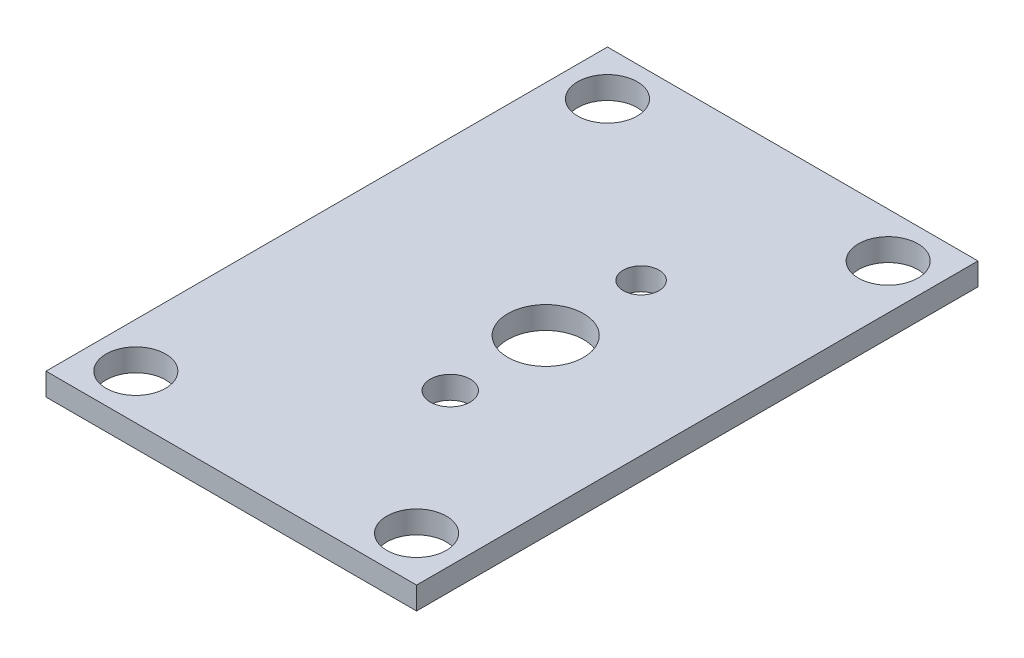
ISO-10303-21;
HEADER;
FILE_DESCRIPTION(('STEP AP214'),'2;1');
FILE_NAME('part.step','',(''),(''),'','','');
FILE_SCHEMA(('AUTOMOTIVE_DESIGN { 1 0 10303 214 1 1 1 1 }'));
ENDSEC;
DATA;
#1=APPLICATION_CONTEXT('core data for automotive mechanical design processes');
#2=APPLICATION_PROTOCOL_DEFINITION('international standard','automotive_design',2000,#1);
#3=PRODUCT_CONTEXT('',#1,'mechanical');
#4=PRODUCT('Part','Part','',(#3));
#5=PRODUCT_RELATED_PRODUCT_CATEGORY('part','',(#4));
#6=PRODUCT_DEFINITION_FORMATION('','',#4);
#7=PRODUCT_DEFINITION_CONTEXT('part definition',#1,'design');
#8=PRODUCT_DEFINITION('design','',#6,#7);
#9=PRODUCT_DEFINITION_SHAPE('','',#8);
#10=(LENGTH_UNIT() NAMED_UNIT(*) SI_UNIT(.MILLI.,.METRE.));
#11=(NAMED_UNIT(*) PLANE_ANGLE_UNIT() SI_UNIT($,.RADIAN.));
#12=(NAMED_UNIT(*) SI_UNIT($,.STERADIAN.) SOLID_ANGLE_UNIT());
#13=UNCERTAINTY_MEASURE_WITH_UNIT(LENGTH_MEASURE(1.E-05),#10,'distance_accuracy_value','');
#14=(GEOMETRIC_REPRESENTATION_CONTEXT(3) GLOBAL_UNCERTAINTY_ASSIGNED_CONTEXT((#13)) GLOBAL_UNIT_ASSIGNED_CONTEXT((#10,
#11,#12)) REPRESENTATION_CONTEXT('',''));
#15=CARTESIAN_POINT('',(0.,0.,0.));
#16=DIRECTION('',(0.,0.,1.));
#17=DIRECTION('',(1.,0.,0.));
#18=AXIS2_PLACEMENT_3D('',#15,#16,#17);
#19=CARTESIAN_POINT('',(0.,0.,0.));
#20=DIRECTION('',(0.,1.,0.));
#21=DIRECTION('',(0.,0.,1.));
#22=AXIS2_PLACEMENT_3D('',#19,#20,#21);
#23=PLANE('',#22);
#24=CARTESIAN_POINT('',(1.27695167286245,0.,-19.8847583643123));
#25=DIRECTION('',(0.,1.,0.));
#26=DIRECTION('',(0.,0.,1.));
#27=AXIS2_PLACEMENT_3D('',#24,#25,#26);
#28=CIRCLE('',#27,1.58978016760219);
#29=CARTESIAN_POINT('',(1.27695167286245,0.,-18.2949781967101));
#30=VERTEX_POINT('',#29);
#31=EDGE_CURVE('E125',#30,#30,#28,.T.);
#32=ORIENTED_EDGE('',*,*,#31,.T.);
#33=EDGE_LOOP('',(#32));
#34=FACE_BOUND('',#33,.T.);
#35=CARTESIAN_POINT('',(1.27695167286245,0.,-2.88475836431227));
#36=DIRECTION('',(0.,1.,0.));
#37=DIRECTION('',(0.,0.,1.));
#38=AXIS2_PLACEMENT_3D('',#35,#36,#37);
#39=CIRCLE('',#38,1.77742826201975);
#40=CARTESIAN_POINT('',(1.27695167286245,0.,-1.10733010229252));
#41=VERTEX_POINT('',#40);
#42=EDGE_CURVE('E123',#41,#41,#39,.T.);
#43=ORIENTED_EDGE('',*,*,#42,.T.);
#44=EDGE_LOOP('',(#43));
#45=FACE_BOUND('',#44,.T.);
#46=CARTESIAN_POINT('',(10.7769516728624,0.,-32.3847583643123));
#47=DIRECTION('',(0.,1.,0.));
#48=DIRECTION('',(0.,0.,1.));
#49=AXIS2_PLACEMENT_3D('',#46,#47,#48);
#50=CIRCLE('',#49,2.65);
#51=CARTESIAN_POINT('',(10.7769516728624,0.,-29.7347583643123));
#52=VERTEX_POINT('',#51);
#53=EDGE_CURVE('E143',#52,#52,#50,.F.);
#54=ORIENTED_EDGE('',*,*,#53,.F.);
#55=EDGE_LOOP('',(#54));
#56=FACE_BOUND('',#55,.T.);
#57=CARTESIAN_POINT('',(10.7769516728625,0.,9.61524163568773));
#58=DIRECTION('',(0.,1.,0.));
#59=DIRECTION('',(0.,0.,1.));
#60=AXIS2_PLACEMENT_3D('',#57,#58,#59);
#61=CIRCLE('',#60,2.65);
#62=CARTESIAN_POINT('',(10.7769516728625,0.,12.2652416356877));
#63=VERTEX_POINT('',#62);
#64=EDGE_CURVE('E137',#63,#63,#61,.F.);
#65=ORIENTED_EDGE('',*,*,#64,.F.);
#66=EDGE_LOOP('',(#65));
#67=FACE_BOUND('',#66,.T.);
#68=CARTESIAN_POINT('',(1.27695167286245,0.,-11.3847583643123));
#69=DIRECTION('',(0.,1.,0.));
#70=DIRECTION('',(0.,0.,1.));
#71=AXIS2_PLACEMENT_3D('',#68,#69,#70);
#72=CIRCLE('',#71,3.375);
#73=CARTESIAN_POINT('',(1.27695167286245,0.,-8.00975836431227));
#74=VERTEX_POINT('',#73);
#75=EDGE_CURVE('E111',#74,#74,#72,.T.);
#76=ORIENTED_EDGE('',*,*,#75,.T.);
#77=EDGE_LOOP('',(#76));
#78=FACE_BOUND('',#77,.T.);
#79=DIRECTION('',(1.,0.,0.));
#80=VECTOR('',#79,1.);
#81=CARTESIAN_POINT('',(-10.2230483271375,0.,13.6152416356877));
#82=LINE('',#81,#80);
#83=CARTESIAN_POINT('',(-18.2230483271375,0.,13.6152416356877));
#84=VERTEX_POINT('',#83);
#85=CARTESIAN_POINT('',(14.7769516728625,0.,13.6152416356877));
#86=VERTEX_POINT('',#85);
#87=EDGE_CURVE('E66',#84,#86,#82,.T.);
#88=ORIENTED_EDGE('',*,*,#87,.F.);
#89=DIRECTION('',(0.,0.,1.));
#90=VECTOR('',#89,1.);
#91=CARTESIAN_POINT('',(-18.2230483271375,0.,-36.3847583643123));
#92=LINE('',#91,#90);
#93=CARTESIAN_POINT('',(-18.2230483271375,0.,-36.3847583643123));
#94=VERTEX_POINT('',#93);
#95=EDGE_CURVE('E95',#94,#84,#92,.T.);
#96=ORIENTED_EDGE('',*,*,#95,.F.);
#97=DIRECTION('',(-1.,0.,0.));
#98=VECTOR('',#97,1.);
#99=CARTESIAN_POINT('',(-10.2230483271376,0.,-36.3847583643123));
#100=LINE('',#99,#98);
#101=CARTESIAN_POINT('',(14.7769516728625,0.,-36.3847583643123));
#102=VERTEX_POINT('',#101);
#103=EDGE_CURVE('E84',#102,#94,#100,.T.);
#104=ORIENTED_EDGE('',*,*,#103,.F.);
#105=DIRECTION('',(0.,0.,-1.));
#106=VECTOR('',#105,1.);
#107=CARTESIAN_POINT('',(14.7769516728625,0.,-36.3847583643123));
#108=LINE('',#107,#106);
#109=EDGE_CURVE('E92',#86,#102,#108,.T.);
#110=ORIENTED_EDGE('',*,*,#109,.F.);
#111=EDGE_LOOP('',(#88,#96,#104,#110));
#112=FACE_BOUND('',#111,.T.);
#113=CARTESIAN_POINT('',(-14.2230483271375,0.,-32.3847583643123));
#114=DIRECTION('',(0.,1.,0.));
#115=DIRECTION('',(0.,0.,1.));
#116=AXIS2_PLACEMENT_3D('',#113,#114,#115);
#117=CIRCLE('',#116,2.65);
#118=CARTESIAN_POINT('',(-14.2230483271375,0.,-29.7347583643123));
#119=VERTEX_POINT('',#118);
#120=EDGE_CURVE('E40',#119,#119,#117,.F.);
#121=ORIENTED_EDGE('',*,*,#120,.F.);
#122=EDGE_LOOP('',(#121));
#123=FACE_BOUND('',#122,.T.);
#124=CARTESIAN_POINT('',(-14.2230483271375,0.,9.61524163568773));
#125=DIRECTION('',(0.,1.,0.));
#126=DIRECTION('',(0.,0.,1.));
#127=AXIS2_PLACEMENT_3D('',#124,#125,#126);
#128=CIRCLE('',#127,2.65);
#129=CARTESIAN_POINT('',(-14.2230483271375,0.,12.2652416356877));
#130=VERTEX_POINT('',#129);
#131=EDGE_CURVE('E325',#130,#130,#128,.F.);
#132=ORIENTED_EDGE('',*,*,#131,.F.);
#133=EDGE_LOOP('',(#132));
#134=FACE_BOUND('',#133,.T.);
#135=ADVANCED_FACE('F36',(#34,#45,#56,#67,#78,#112,#123,#134),#23,.F.);
#136=CARTESIAN_POINT('',(0.,2.,0.));
#137=DIRECTION('',(0.,1.,0.));
#138=DIRECTION('',(0.,0.,1.));
#139=AXIS2_PLACEMENT_3D('',#136,#137,#138);
#140=PLANE('',#139);
#141=DIRECTION('',(0.,0.,-1.));
#142=VECTOR('',#141,1.);
#143=CARTESIAN_POINT('',(14.7769516728625,2.,-36.3847583643123));
#144=LINE('',#143,#142);
#145=CARTESIAN_POINT('',(14.7769516728625,2.,13.6152416356877));
#146=VERTEX_POINT('',#145);
#147=CARTESIAN_POINT('',(14.7769516728625,2.,-36.3847583643123));
#148=VERTEX_POINT('',#147);
#149=EDGE_CURVE('E55',#146,#148,#144,.T.);
#150=ORIENTED_EDGE('',*,*,#149,.T.);
#151=DIRECTION('',(-1.,0.,0.));
#152=VECTOR('',#151,1.);
#153=CARTESIAN_POINT('',(-10.2230483271376,2.,-36.3847583643123));
#154=LINE('',#153,#152);
#155=CARTESIAN_POINT('',(-18.2230483271376,2.,-36.3847583643123));
#156=VERTEX_POINT('',#155);
#157=EDGE_CURVE('E71',#148,#156,#154,.T.);
#158=ORIENTED_EDGE('',*,*,#157,.T.);
#159=DIRECTION('',(0.,0.,-1.));
#160=VECTOR('',#159,1.);
#161=CARTESIAN_POINT('',(-18.2230483271376,2.,-36.3847583643123));
#162=LINE('',#161,#160);
#163=CARTESIAN_POINT('',(-18.2230483271375,2.,13.6152416356877));
#164=VERTEX_POINT('',#163);
#165=EDGE_CURVE('E100',#164,#156,#162,.T.);
#166=ORIENTED_EDGE('',*,*,#165,.F.);
#167=DIRECTION('',(1.,0.,0.));
#168=VECTOR('',#167,1.);
#169=CARTESIAN_POINT('',(-10.2230483271375,2.,13.6152416356877));
#170=LINE('',#169,#168);
#171=EDGE_CURVE('E91',#164,#146,#170,.T.);
#172=ORIENTED_EDGE('',*,*,#171,.T.);
#173=EDGE_LOOP('',(#150,#158,#166,#172));
#174=FACE_BOUND('',#173,.T.);
#175=CARTESIAN_POINT('',(10.7769516728624,2.,-32.3847583643123));
#176=DIRECTION('',(0.,-1.,0.));
#177=DIRECTION('',(0.,0.,1.));
#178=AXIS2_PLACEMENT_3D('',#175,#176,#177);
#179=CIRCLE('',#178,2.65);
#180=CARTESIAN_POINT('',(10.7769516728624,2.,-29.7347583643123));
#181=VERTEX_POINT('',#180);
#182=EDGE_CURVE('E132',#181,#181,#179,.T.);
#183=ORIENTED_EDGE('',*,*,#182,.T.);
#184=EDGE_LOOP('',(#183));
#185=FACE_BOUND('',#184,.T.);
#186=CARTESIAN_POINT('',(10.7769516728625,2.,9.61524163568773));
#187=DIRECTION('',(0.,-1.,0.));
#188=DIRECTION('',(0.,0.,1.));
#189=AXIS2_PLACEMENT_3D('',#186,#187,#188);
#190=CIRCLE('',#189,2.65);
#191=CARTESIAN_POINT('',(10.7769516728625,2.,12.2652416356877));
#192=VERTEX_POINT('',#191);
#193=EDGE_CURVE('E128',#192,#192,#190,.T.);
#194=ORIENTED_EDGE('',*,*,#193,.T.);
#195=EDGE_LOOP('',(#194));
#196=FACE_BOUND('',#195,.T.);
#197=CARTESIAN_POINT('',(-14.2230483271375,2.,-32.3847583643123));
#198=DIRECTION('',(0.,1.,0.));
#199=DIRECTION('',(0.,0.,1.));
#200=AXIS2_PLACEMENT_3D('',#197,#198,#199);
#201=CIRCLE('',#200,2.65);
#202=CARTESIAN_POINT('',(-14.2230483271375,2.,-29.7347583643123));
#203=VERTEX_POINT('',#202);
#204=EDGE_CURVE('E102',#203,#203,#201,.T.);
#205=ORIENTED_EDGE('',*,*,#204,.F.);
#206=EDGE_LOOP('',(#205));
#207=FACE_BOUND('',#206,.T.);
#208=CARTESIAN_POINT('',(-14.2230483271375,2.,9.61524163568773));
#209=DIRECTION('',(0.,1.,0.));
#210=DIRECTION('',(0.,0.,1.));
#211=AXIS2_PLACEMENT_3D('',#208,#209,#210);
#212=CIRCLE('',#211,2.65);
#213=CARTESIAN_POINT('',(-14.2230483271375,2.,12.2652416356877));
#214=VERTEX_POINT('',#213);
#215=EDGE_CURVE('E106',#214,#214,#212,.T.);
#216=ORIENTED_EDGE('',*,*,#215,.F.);
#217=EDGE_LOOP('',(#216));
#218=FACE_BOUND('',#217,.T.);
#219=CARTESIAN_POINT('',(1.27695167286245,2.,-19.8847583643123));
#220=DIRECTION('',(0.,1.,0.));
#221=DIRECTION('',(0.,0.,1.));
#222=AXIS2_PLACEMENT_3D('',#219,#220,#221);
#223=CIRCLE('',#222,1.58978016760219);
#224=CARTESIAN_POINT('',(1.27695167286245,2.,-18.2949781967101));
#225=VERTEX_POINT('',#224);
#226=EDGE_CURVE('E126',#225,#225,#223,.T.);
#227=ORIENTED_EDGE('',*,*,#226,.F.);
#228=EDGE_LOOP('',(#227));
#229=FACE_BOUND('',#228,.T.);
#230=CARTESIAN_POINT('',(1.27695167286245,2.,-2.88475836431227));
#231=DIRECTION('',(0.,1.,0.));
#232=DIRECTION('',(0.,0.,1.));
#233=AXIS2_PLACEMENT_3D('',#230,#231,#232);
#234=CIRCLE('',#233,1.77742826201975);
#235=CARTESIAN_POINT('',(1.27695167286245,2.,-1.10733010229252));
#236=VERTEX_POINT('',#235);
#237=EDGE_CURVE('E162',#236,#236,#234,.T.);
#238=ORIENTED_EDGE('',*,*,#237,.F.);
#239=EDGE_LOOP('',(#238));
#240=FACE_BOUND('',#239,.T.);
#241=CARTESIAN_POINT('',(1.27695167286245,2.,-11.3847583643123));
#242=DIRECTION('',(0.,1.,0.));
#243=DIRECTION('',(0.,0.,1.));
#244=AXIS2_PLACEMENT_3D('',#241,#242,#243);
#245=CIRCLE('',#244,3.375);
#246=CARTESIAN_POINT('',(1.27695167286245,2.,-8.00975836431227));
#247=VERTEX_POINT('',#246);
#248=EDGE_CURVE('E112',#247,#247,#245,.T.);
#249=ORIENTED_EDGE('',*,*,#248,.F.);
#250=EDGE_LOOP('',(#249));
#251=FACE_BOUND('',#250,.T.);
#252=ADVANCED_FACE('F152',(#174,#185,#196,#207,#218,#229,#240,#251),#140,.T.);
#253=CARTESIAN_POINT('',(-10.2230483271375,2.,13.6152416356877));
#254=DIRECTION('',(0.,0.,-1.));
#255=DIRECTION('',(-1.,0.,0.));
#256=AXIS2_PLACEMENT_3D('',#253,#254,#255);
#257=PLANE('',#256);
#258=DIRECTION('',(0.,1.,0.));
#259=VECTOR('',#258,1.);
#260=CARTESIAN_POINT('',(-18.2230483271375,2.,13.6152416356877));
#261=LINE('',#260,#259);
#262=EDGE_CURVE('E101',#84,#164,#261,.T.);
#263=ORIENTED_EDGE('',*,*,#262,.F.);
#264=ORIENTED_EDGE('',*,*,#87,.T.);
#265=DIRECTION('',(0.,-1.,0.));
#266=VECTOR('',#265,1.);
#267=CARTESIAN_POINT('',(14.7769516728625,2.,13.6152416356877));
#268=LINE('',#267,#266);
#269=EDGE_CURVE('E11',#146,#86,#268,.T.);
#270=ORIENTED_EDGE('',*,*,#269,.F.);
#271=ORIENTED_EDGE('',*,*,#171,.F.);
#272=EDGE_LOOP('',(#263,#264,#270,#271));
#273=FACE_BOUND('',#272,.T.);
#274=ADVANCED_FACE('F38',(#273),#257,.F.);
#275=CARTESIAN_POINT('',(14.7769516728625,2.,-36.3847583643123));
#276=DIRECTION('',(-1.,0.,0.));
#277=DIRECTION('',(0.,0.,1.));
#278=AXIS2_PLACEMENT_3D('',#275,#276,#277);
#279=PLANE('',#278);
#280=DIRECTION('',(0.,-1.,0.));
#281=VECTOR('',#280,1.);
#282=CARTESIAN_POINT('',(14.7769516728625,2.,-36.3847583643123));
#283=LINE('',#282,#281);
#284=EDGE_CURVE('E46',#148,#102,#283,.T.);
#285=ORIENTED_EDGE('',*,*,#284,.F.);
#286=ORIENTED_EDGE('',*,*,#149,.F.);
#287=ORIENTED_EDGE('',*,*,#269,.T.);
#288=ORIENTED_EDGE('',*,*,#109,.T.);
#289=EDGE_LOOP('',(#285,#286,#287,#288));
#290=FACE_BOUND('',#289,.T.);
#291=ADVANCED_FACE('F178',(#290),#279,.F.);
#292=CARTESIAN_POINT('',(-10.2230483271376,2.,-36.3847583643123));
#293=DIRECTION('',(0.,0.,1.));
#294=DIRECTION('',(1.,0.,0.));
#295=AXIS2_PLACEMENT_3D('',#292,#293,#294);
#296=PLANE('',#295);
#297=ORIENTED_EDGE('',*,*,#103,.T.);
#298=DIRECTION('',(0.,-1.,0.));
#299=VECTOR('',#298,1.);
#300=CARTESIAN_POINT('',(-18.2230483271376,2.,-36.3847583643123));
#301=LINE('',#300,#299);
#302=EDGE_CURVE('E88',#156,#94,#301,.T.);
#303=ORIENTED_EDGE('',*,*,#302,.F.);
#304=ORIENTED_EDGE('',*,*,#157,.F.);
#305=ORIENTED_EDGE('',*,*,#284,.T.);
#306=EDGE_LOOP('',(#297,#303,#304,#305));
#307=FACE_BOUND('',#306,.T.);
#308=ADVANCED_FACE('F86',(#307),#296,.F.);
#309=CARTESIAN_POINT('',(1.27695167286245,2.,-11.3847583643123));
#310=DIRECTION('',(0.,-1.,0.));
#311=DIRECTION('',(0.,0.,-1.));
#312=AXIS2_PLACEMENT_3D('',#309,#310,#311);
#313=CYLINDRICAL_SURFACE('',#312,3.375);
#314=ORIENTED_EDGE('',*,*,#248,.T.);
#315=EDGE_LOOP('',(#314));
#316=FACE_BOUND('',#315,.T.);
#317=ORIENTED_EDGE('',*,*,#75,.F.);
#318=EDGE_LOOP('',(#317));
#319=FACE_BOUND('',#318,.T.);
#320=ADVANCED_FACE('F165',(#316,#319),#313,.F.);
#321=CARTESIAN_POINT('',(-18.2230483271375,0.,0.));
#322=DIRECTION('',(-1.,0.,0.));
#323=DIRECTION('',(0.,0.,1.));
#324=AXIS2_PLACEMENT_3D('',#321,#322,#323);
#325=PLANE('',#324);
#326=ORIENTED_EDGE('',*,*,#95,.T.);
#327=ORIENTED_EDGE('',*,*,#262,.T.);
#328=ORIENTED_EDGE('',*,*,#165,.T.);
#329=ORIENTED_EDGE('',*,*,#302,.T.);
#330=EDGE_LOOP('',(#326,#327,#328,#329));
#331=FACE_BOUND('',#330,.T.);
#332=ADVANCED_FACE('F99',(#331),#325,.T.);
#333=CARTESIAN_POINT('',(-14.2230483271375,-1.3,9.61524163568773));
#334=DIRECTION('',(0.,1.,0.));
#335=DIRECTION('',(0.,0.,1.));
#336=AXIS2_PLACEMENT_3D('',#333,#334,#335);
#337=CYLINDRICAL_SURFACE('',#336,2.65);
#338=ORIENTED_EDGE('',*,*,#131,.T.);
#339=EDGE_LOOP('',(#338));
#340=FACE_BOUND('',#339,.T.);
#341=ORIENTED_EDGE('',*,*,#215,.T.);
#342=EDGE_LOOP('',(#341));
#343=FACE_BOUND('',#342,.T.);
#344=ADVANCED_FACE('F150',(#340,#343),#337,.F.);
#345=CARTESIAN_POINT('',(-14.2230483271375,-1.3,-32.3847583643123));
#346=DIRECTION('',(0.,1.,0.));
#347=DIRECTION('',(0.,0.,1.));
#348=AXIS2_PLACEMENT_3D('',#345,#346,#347);
#349=CYLINDRICAL_SURFACE('',#348,2.65);
#350=ORIENTED_EDGE('',*,*,#120,.T.);
#351=EDGE_LOOP('',(#350));
#352=FACE_BOUND('',#351,.T.);
#353=ORIENTED_EDGE('',*,*,#204,.T.);
#354=EDGE_LOOP('',(#353));
#355=FACE_BOUND('',#354,.T.);
#356=ADVANCED_FACE('F190',(#352,#355),#349,.F.);
#357=CARTESIAN_POINT('',(10.7769516728625,-1.3,9.61524163568773));
#358=DIRECTION('',(0.,1.,0.));
#359=DIRECTION('',(0.,0.,1.));
#360=AXIS2_PLACEMENT_3D('',#357,#358,#359);
#361=CYLINDRICAL_SURFACE('',#360,2.65);
#362=ORIENTED_EDGE('',*,*,#193,.F.);
#363=EDGE_LOOP('',(#362));
#364=FACE_BOUND('',#363,.T.);
#365=ORIENTED_EDGE('',*,*,#64,.T.);
#366=EDGE_LOOP('',(#365));
#367=FACE_BOUND('',#366,.T.);
#368=ADVANCED_FACE('F192',(#364,#367),#361,.F.);
#369=CARTESIAN_POINT('',(10.7769516728624,-1.3,-32.3847583643123));
#370=DIRECTION('',(0.,1.,0.));
#371=DIRECTION('',(0.,0.,1.));
#372=AXIS2_PLACEMENT_3D('',#369,#370,#371);
#373=CYLINDRICAL_SURFACE('',#372,2.65);
#374=ORIENTED_EDGE('',*,*,#182,.F.);
#375=EDGE_LOOP('',(#374));
#376=FACE_BOUND('',#375,.T.);
#377=ORIENTED_EDGE('',*,*,#53,.T.);
#378=EDGE_LOOP('',(#377));
#379=FACE_BOUND('',#378,.T.);
#380=ADVANCED_FACE('F199',(#376,#379),#373,.F.);
#381=CARTESIAN_POINT('',(1.27695167286245,-8.,-2.88475836431227));
#382=DIRECTION('',(0.,1.,0.));
#383=DIRECTION('',(0.,0.,1.));
#384=AXIS2_PLACEMENT_3D('',#381,#382,#383);
#385=CYLINDRICAL_SURFACE('',#384,1.77742826201975);
#386=ORIENTED_EDGE('',*,*,#237,.T.);
#387=EDGE_LOOP('',(#386));
#388=FACE_BOUND('',#387,.T.);
#389=ORIENTED_EDGE('',*,*,#42,.F.);
#390=EDGE_LOOP('',(#389));
#391=FACE_BOUND('',#390,.T.);
#392=ADVANCED_FACE('F244',(#388,#391),#385,.F.);
#393=CARTESIAN_POINT('',(1.27695167286245,-8.,-19.8847583643123));
#394=DIRECTION('',(0.,1.,0.));
#395=DIRECTION('',(0.,0.,1.));
#396=AXIS2_PLACEMENT_3D('',#393,#394,#395);
#397=CYLINDRICAL_SURFACE('',#396,1.58978016760219);
#398=ORIENTED_EDGE('',*,*,#226,.T.);
#399=EDGE_LOOP('',(#398));
#400=FACE_BOUND('',#399,.T.);
#401=ORIENTED_EDGE('',*,*,#31,.F.);
#402=EDGE_LOOP('',(#401));
#403=FACE_BOUND('',#402,.T.);
#404=ADVANCED_FACE('F250',(#400,#403),#397,.F.);
#405=CLOSED_SHELL('',(#135,#252,#274,#291,#308,#320,#332,#344,#356,#368,#380,#392,#404));
#406=MANIFOLD_SOLID_BREP('B2',#405);
#407=ADVANCED_BREP_SHAPE_REPRESENTATION('',(#18,#406),#14);
#408=SHAPE_DEFINITION_REPRESENTATION(#9,#407);
ENDSEC;
END-ISO-10303-21;
